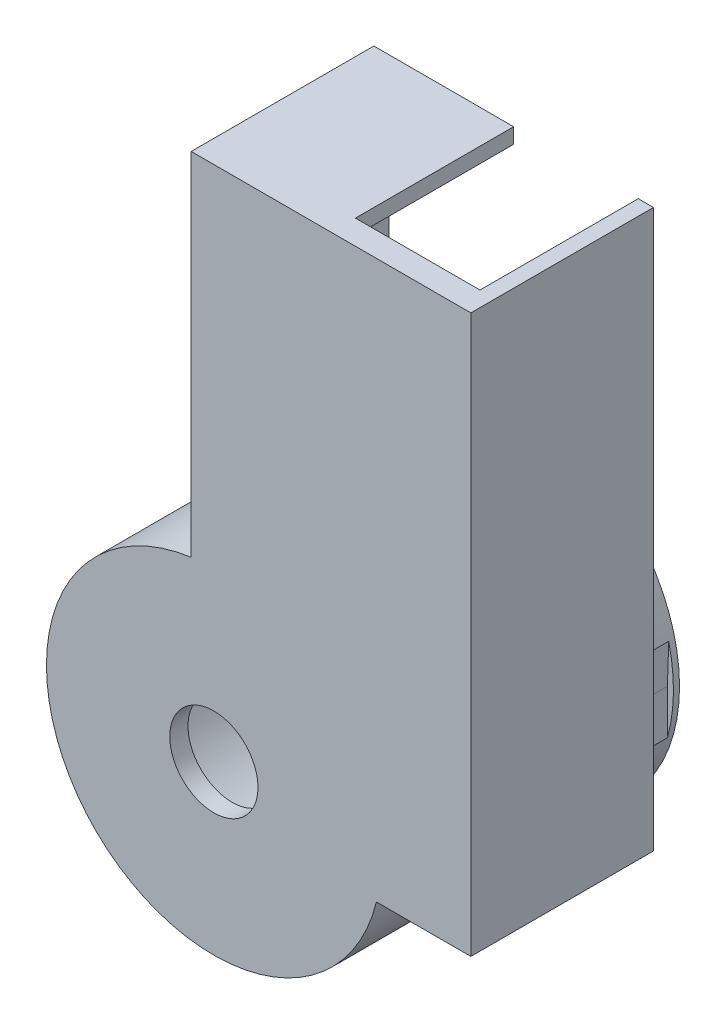
ISO-10303-21;
HEADER;
FILE_DESCRIPTION(('STEP AP214'),'2;1');
FILE_NAME('part.step','',(''),(''),'','','');
FILE_SCHEMA(('AUTOMOTIVE_DESIGN { 1 0 10303 214 1 1 1 1 }'));
ENDSEC;
DATA;
#1=APPLICATION_CONTEXT('core data for automotive mechanical design processes');
#2=APPLICATION_PROTOCOL_DEFINITION('international standard','automotive_design',2000,#1);
#3=PRODUCT_CONTEXT('',#1,'mechanical');
#4=PRODUCT('Part','Part','',(#3));
#5=PRODUCT_RELATED_PRODUCT_CATEGORY('part','',(#4));
#6=PRODUCT_DEFINITION_FORMATION('','',#4);
#7=PRODUCT_DEFINITION_CONTEXT('part definition',#1,'design');
#8=PRODUCT_DEFINITION('design','',#6,#7);
#9=PRODUCT_DEFINITION_SHAPE('','',#8);
#10=(LENGTH_UNIT() NAMED_UNIT(*) SI_UNIT(.MILLI.,.METRE.));
#11=(NAMED_UNIT(*) PLANE_ANGLE_UNIT() SI_UNIT($,.RADIAN.));
#12=(NAMED_UNIT(*) SI_UNIT($,.STERADIAN.) SOLID_ANGLE_UNIT());
#13=UNCERTAINTY_MEASURE_WITH_UNIT(LENGTH_MEASURE(1.E-05),#10,'distance_accuracy_value','');
#14=(GEOMETRIC_REPRESENTATION_CONTEXT(3) GLOBAL_UNCERTAINTY_ASSIGNED_CONTEXT((#13)) GLOBAL_UNIT_ASSIGNED_CONTEXT((#10,
#11,#12)) REPRESENTATION_CONTEXT('',''));
#15=CARTESIAN_POINT('',(0.,0.,0.));
#16=DIRECTION('',(0.,0.,1.));
#17=DIRECTION('',(1.,0.,0.));
#18=AXIS2_PLACEMENT_3D('',#15,#16,#17);
#19=CARTESIAN_POINT('',(0.,-55.,-25.));
#20=DIRECTION('',(0.,0.,1.));
#21=DIRECTION('',(1.,0.,0.));
#22=AXIS2_PLACEMENT_3D('',#19,#20,#21);
#23=CYLINDRICAL_SURFACE('',#22,18.9);
#24=CARTESIAN_POINT('',(0.,-55.,-25.));
#25=DIRECTION('',(0.,0.,-1.));
#26=DIRECTION('',(-1.,0.,0.));
#27=AXIS2_PLACEMENT_3D('',#24,#25,#26);
#28=CIRCLE('',#27,18.9);
#29=CARTESIAN_POINT('',(-18.9,-55.,-25.));
#30=VERTEX_POINT('',#29);
#31=EDGE_CURVE('E253',#30,#30,#28,.T.);
#32=ORIENTED_EDGE('',*,*,#31,.T.);
#33=EDGE_LOOP('',(#32));
#34=FACE_BOUND('',#33,.T.);
#35=CARTESIAN_POINT('',(0.,-55.,21.));
#36=DIRECTION('',(0.,0.,1.));
#37=DIRECTION('',(1.,0.,0.));
#38=AXIS2_PLACEMENT_3D('',#35,#36,#37);
#39=CIRCLE('',#38,18.9);
#40=CARTESIAN_POINT('',(18.9,-55.,21.));
#41=VERTEX_POINT('',#40);
#42=EDGE_CURVE('E506',#41,#41,#39,.T.);
#43=ORIENTED_EDGE('',*,*,#42,.T.);
#44=EDGE_LOOP('',(#43));
#45=FACE_BOUND('',#44,.T.);
#46=ADVANCED_FACE('F76',(#34,#45),#23,.F.);
#47=CARTESIAN_POINT('',(28.235445078776,-0.900390084330371,-24.));
#48=DIRECTION('',(0.999491944603137,-0.0318724437945979,0.));
#49=DIRECTION('',(0.0318724437945979,0.999491944603137,0.));
#50=AXIS2_PLACEMENT_3D('',#47,#48,#49);
#51=PLANE('',#50);
#52=DIRECTION('',(0.,0.,1.));
#53=VECTOR('',#52,1.);
#54=CARTESIAN_POINT('',(26.7179309405717,-48.4883054237133,-24.));
#55=LINE('',#54,#53);
#56=CARTESIAN_POINT('',(26.7179309405717,-48.4883054237133,-1.));
#57=VERTEX_POINT('',#56);
#58=CARTESIAN_POINT('',(26.7179309405717,-48.4883054237133,21.));
#59=VERTEX_POINT('',#58);
#60=EDGE_CURVE('E300',#57,#59,#55,.T.);
#61=ORIENTED_EDGE('',*,*,#60,.T.);
#62=DIRECTION('',(-0.0318724437945979,-0.999491944603137,0.));
#63=VECTOR('',#62,1.);
#64=CARTESIAN_POINT('',(28.235445078776,-0.900390084330371,21.));
#65=LINE('',#64,#63);
#66=CARTESIAN_POINT('',(26.5102818239271,-55.,21.));
#67=VERTEX_POINT('',#66);
#68=EDGE_CURVE('E91',#59,#67,#65,.T.);
#69=ORIENTED_EDGE('',*,*,#68,.T.);
#70=DIRECTION('',(0.,0.,1.));
#71=VECTOR('',#70,1.);
#72=CARTESIAN_POINT('',(26.5102818239271,-55.,-24.));
#73=LINE('',#72,#71);
#74=CARTESIAN_POINT('',(26.5102818239271,-55.,-24.));
#75=VERTEX_POINT('',#74);
#76=EDGE_CURVE('E297',#75,#67,#73,.T.);
#77=ORIENTED_EDGE('',*,*,#76,.F.);
#78=DIRECTION('',(0.0318724437945979,0.999491944603137,0.));
#79=VECTOR('',#78,1.);
#80=CARTESIAN_POINT('',(28.235445078776,-0.900390084330371,-24.));
#81=LINE('',#80,#79);
#82=CARTESIAN_POINT('',(26.7179309405717,-48.4883054237133,-24.));
#83=VERTEX_POINT('',#82);
#84=EDGE_CURVE('E287',#75,#83,#81,.T.);
#85=ORIENTED_EDGE('',*,*,#84,.T.);
#86=EDGE_CURVE('E254',#83,#57,#55,.T.);
#87=ORIENTED_EDGE('',*,*,#86,.T.);
#88=EDGE_LOOP('',(#61,#69,#77,#85,#87));
#89=FACE_BOUND('',#88,.T.);
#90=ADVANCED_FACE('F465',(#89),#51,.T.);
#91=CARTESIAN_POINT('',(26.5102818239271,0.,-24.));
#92=DIRECTION('',(-1.,0.,0.));
#93=DIRECTION('',(0.,0.,1.));
#94=AXIS2_PLACEMENT_3D('',#91,#92,#93);
#95=PLANE('',#94);
#96=DIRECTION('',(0.,1.,0.));
#97=VECTOR('',#96,1.);
#98=CARTESIAN_POINT('',(26.5102818239271,0.,21.));
#99=LINE('',#98,#97);
#100=CARTESIAN_POINT('',(26.5102818239271,-62.3112897368359,21.));
#101=VERTEX_POINT('',#100);
#102=EDGE_CURVE('E98',#101,#67,#99,.T.);
#103=ORIENTED_EDGE('',*,*,#102,.F.);
#104=DIRECTION('',(0.,0.,1.));
#105=VECTOR('',#104,1.);
#106=CARTESIAN_POINT('',(26.5102818239271,-62.3112897368359,-24.));
#107=LINE('',#106,#105);
#108=CARTESIAN_POINT('',(26.5102818239271,-62.3112897368359,-24.));
#109=VERTEX_POINT('',#108);
#110=EDGE_CURVE('E301',#109,#101,#107,.T.);
#111=ORIENTED_EDGE('',*,*,#110,.F.);
#112=DIRECTION('',(0.,-1.,0.));
#113=VECTOR('',#112,1.);
#114=CARTESIAN_POINT('',(26.5102818239271,0.,-24.));
#115=LINE('',#114,#113);
#116=EDGE_CURVE('E291',#75,#109,#115,.T.);
#117=ORIENTED_EDGE('',*,*,#116,.F.);
#118=ORIENTED_EDGE('',*,*,#76,.T.);
#119=EDGE_LOOP('',(#103,#111,#117,#118));
#120=FACE_BOUND('',#119,.T.);
#121=ADVANCED_FACE('F542',(#120),#95,.F.);
#122=CARTESIAN_POINT('',(0.,-81.9229318060306,-24.));
#123=DIRECTION('',(0.,-1.,0.));
#124=DIRECTION('',(0.,0.,-1.));
#125=AXIS2_PLACEMENT_3D('',#122,#123,#124);
#126=PLANE('',#125);
#127=DIRECTION('',(0.,0.,1.));
#128=VECTOR('',#127,1.);
#129=CARTESIAN_POINT('',(5.60408270529834,-81.9229318060306,-24.));
#130=LINE('',#129,#128);
#131=CARTESIAN_POINT('',(5.60408270529834,-81.9229318060306,-24.));
#132=VERTEX_POINT('',#131);
#133=CARTESIAN_POINT('',(5.60408270529834,-81.9229318060306,21.));
#134=VERTEX_POINT('',#133);
#135=EDGE_CURVE('E284',#132,#134,#130,.T.);
#136=ORIENTED_EDGE('',*,*,#135,.T.);
#137=DIRECTION('',(-1.,0.,0.));
#138=VECTOR('',#137,1.);
#139=CARTESIAN_POINT('',(0.,-81.9229318060306,21.));
#140=LINE('',#139,#138);
#141=CARTESIAN_POINT('',(-5.60408270529832,-81.9229318060306,21.));
#142=VERTEX_POINT('',#141);
#143=EDGE_CURVE('E498',#134,#142,#140,.T.);
#144=ORIENTED_EDGE('',*,*,#143,.T.);
#145=DIRECTION('',(0.,0.,1.));
#146=VECTOR('',#145,1.);
#147=CARTESIAN_POINT('',(-5.60408270529832,-81.9229318060306,-24.));
#148=LINE('',#147,#146);
#149=CARTESIAN_POINT('',(-5.60408270529832,-81.9229318060306,-24.));
#150=VERTEX_POINT('',#149);
#151=EDGE_CURVE('E283',#150,#142,#148,.T.);
#152=ORIENTED_EDGE('',*,*,#151,.F.);
#153=DIRECTION('',(1.,0.,0.));
#154=VECTOR('',#153,1.);
#155=CARTESIAN_POINT('',(0.,-81.9229318060306,-24.));
#156=LINE('',#155,#154);
#157=EDGE_CURVE('E277',#150,#132,#156,.T.);
#158=ORIENTED_EDGE('',*,*,#157,.T.);
#159=EDGE_LOOP('',(#136,#144,#152,#158));
#160=FACE_BOUND('',#159,.T.);
#161=ADVANCED_FACE('F567',(#160),#126,.T.);
#162=CARTESIAN_POINT('',(0.,-55.,20.));
#163=DIRECTION('',(0.,0.,1.));
#164=DIRECTION('',(1.,0.,0.));
#165=AXIS2_PLACEMENT_3D('',#162,#163,#164);
#166=CYLINDRICAL_SURFACE('',#165,27.5);
#167=CARTESIAN_POINT('',(0.,-55.,21.));
#168=DIRECTION('',(0.,0.,1.));
#169=DIRECTION('',(1.,0.,0.));
#170=AXIS2_PLACEMENT_3D('',#167,#168,#169);
#171=CIRCLE('',#170,27.5);
#172=CARTESIAN_POINT('',(26.7042036884893,-61.5677625842956,21.));
#173=VERTEX_POINT('',#172);
#174=EDGE_CURVE('E486',#173,#59,#171,.T.);
#175=ORIENTED_EDGE('',*,*,#174,.T.);
#176=ORIENTED_EDGE('',*,*,#60,.F.);
#177=CARTESIAN_POINT('',(1.02890786168874E-13,-55.,-1.));
#178=DIRECTION('',(0.,0.,-1.));
#179=DIRECTION('',(-1.,0.,0.));
#180=AXIS2_PLACEMENT_3D('',#177,#178,#179);
#181=CIRCLE('',#180,27.5);
#182=CARTESIAN_POINT('',(27.19748715521,-50.9322374157041,-1.));
#183=VERTEX_POINT('',#182);
#184=EDGE_CURVE('E340',#57,#183,#181,.T.);
#185=ORIENTED_EDGE('',*,*,#184,.T.);
#186=DIRECTION('',(0.,0.,1.));
#187=VECTOR('',#186,1.);
#188=CARTESIAN_POINT('',(27.19748715521,-50.9322374157041,-1.));
#189=LINE('',#188,#187);
#190=CARTESIAN_POINT('',(27.19748715521,-50.9322374157041,15.));
#191=VERTEX_POINT('',#190);
#192=EDGE_CURVE('E329',#183,#191,#189,.T.);
#193=ORIENTED_EDGE('',*,*,#192,.T.);
#194=CARTESIAN_POINT('',(0.,-55.,15.));
#195=DIRECTION('',(0.,0.,1.));
#196=DIRECTION('',(1.,0.,0.));
#197=AXIS2_PLACEMENT_3D('',#194,#195,#196);
#198=CIRCLE('',#197,27.5000000000001);
#199=CARTESIAN_POINT('',(27.19748715521,-59.0677625842956,15.));
#200=VERTEX_POINT('',#199);
#201=EDGE_CURVE('E338',#200,#191,#198,.T.);
#202=ORIENTED_EDGE('',*,*,#201,.F.);
#203=DIRECTION('',(0.,0.,-1.));
#204=VECTOR('',#203,1.);
#205=CARTESIAN_POINT('',(27.19748715521,-59.0677625842956,15.));
#206=LINE('',#205,#204);
#207=CARTESIAN_POINT('',(27.19748715521,-59.0677625842956,-6.));
#208=VERTEX_POINT('',#207);
#209=EDGE_CURVE('E366',#200,#208,#206,.T.);
#210=ORIENTED_EDGE('',*,*,#209,.T.);
#211=CARTESIAN_POINT('',(9.26342336171615E-13,-54.9999999999992,-6.));
#212=DIRECTION('',(0.,0.,1.));
#213=DIRECTION('',(-1.,0.,0.));
#214=AXIS2_PLACEMENT_3D('',#211,#212,#213);
#215=CIRCLE('',#214,27.4999999999993);
#216=CARTESIAN_POINT('',(26.7042036884893,-61.5677625842956,-6.));
#217=VERTEX_POINT('',#216);
#218=EDGE_CURVE('E393',#217,#208,#215,.T.);
#219=ORIENTED_EDGE('',*,*,#218,.F.);
#220=DIRECTION('',(0.,0.,1.));
#221=VECTOR('',#220,1.);
#222=CARTESIAN_POINT('',(26.7042036884893,-61.5677625842956,20.));
#223=LINE('',#222,#221);
#224=EDGE_CURVE('E270',#217,#173,#223,.T.);
#225=ORIENTED_EDGE('',*,*,#224,.T.);
#226=EDGE_LOOP('',(#175,#176,#185,#193,#202,#210,#219,#225));
#227=FACE_BOUND('',#226,.T.);
#228=ADVANCED_FACE('F336',(#227),#166,.F.);
#229=CARTESIAN_POINT('',(9.26342336171615E-13,-54.9999999999992,-6.));
#230=DIRECTION('',(0.,0.,1.));
#231=DIRECTION('',(1.,0.,0.));
#232=AXIS2_PLACEMENT_3D('',#229,#230,#231);
#233=PLANE('',#232);
#234=DIRECTION('',(0.,-1.,0.));
#235=VECTOR('',#234,1.);
#236=CARTESIAN_POINT('',(39.7172468413498,29.9886968621763,-6.));
#237=LINE('',#236,#235);
#238=CARTESIAN_POINT('',(39.7172468413498,29.9886968621763,-6.));
#239=VERTEX_POINT('',#238);
#240=CARTESIAN_POINT('',(39.7172468413498,-59.0677625842956,-6.));
#241=VERTEX_POINT('',#240);
#242=EDGE_CURVE('E376',#239,#241,#237,.T.);
#243=ORIENTED_EDGE('',*,*,#242,.F.);
#244=DIRECTION('',(1.,0.,0.));
#245=VECTOR('',#244,1.);
#246=CARTESIAN_POINT('',(42.2172468413498,29.9886968621763,-6.));
#247=LINE('',#246,#245);
#248=CARTESIAN_POINT('',(42.2172468413498,29.9886968621763,-6.));
#249=VERTEX_POINT('',#248);
#250=EDGE_CURVE('E399',#239,#249,#247,.T.);
#251=ORIENTED_EDGE('',*,*,#250,.T.);
#252=DIRECTION('',(0.,-1.,0.));
#253=VECTOR('',#252,1.);
#254=CARTESIAN_POINT('',(42.2172468413498,29.9886968621763,-6.));
#255=LINE('',#254,#253);
#256=CARTESIAN_POINT('',(42.2172468413498,-61.5677625842956,-6.));
#257=VERTEX_POINT('',#256);
#258=EDGE_CURVE('E403',#249,#257,#255,.T.);
#259=ORIENTED_EDGE('',*,*,#258,.T.);
#260=DIRECTION('',(-1.,0.,0.));
#261=VECTOR('',#260,1.);
#262=CARTESIAN_POINT('',(26.7042036884893,-61.5677625842956,-6.));
#263=LINE('',#262,#261);
#264=EDGE_CURVE('E264',#257,#217,#263,.T.);
#265=ORIENTED_EDGE('',*,*,#264,.T.);
#266=ORIENTED_EDGE('',*,*,#218,.T.);
#267=DIRECTION('',(-1.,0.,0.));
#268=VECTOR('',#267,1.);
#269=CARTESIAN_POINT('',(26.7042036884893,-59.0677625842956,-6.));
#270=LINE('',#269,#268);
#271=EDGE_CURVE('E379',#241,#208,#270,.T.);
#272=ORIENTED_EDGE('',*,*,#271,.F.);
#273=EDGE_LOOP('',(#243,#251,#259,#265,#266,#272));
#274=FACE_BOUND('',#273,.T.);
#275=ADVANCED_FACE('F484',(#274),#233,.F.);
#276=CARTESIAN_POINT('',(0.,-55.,15.));
#277=DIRECTION('',(0.,0.,-1.));
#278=DIRECTION('',(-1.,0.,0.));
#279=AXIS2_PLACEMENT_3D('',#276,#277,#278);
#280=PLANE('',#279);
#281=CARTESIAN_POINT('',(0.,-55.,15.));
#282=DIRECTION('',(0.,0.,-1.));
#283=DIRECTION('',(-1.,0.,0.));
#284=AXIS2_PLACEMENT_3D('',#281,#282,#283);
#285=CIRCLE('',#284,30.0000000000001);
#286=CARTESIAN_POINT('',(-1.21934232207703,-25.0247901708496,15.));
#287=VERTEX_POINT('',#286);
#288=CARTESIAN_POINT('',(11.9895788082825,-27.5000000000002,15.));
#289=VERTEX_POINT('',#288);
#290=EDGE_CURVE('E355',#287,#289,#285,.T.);
#291=ORIENTED_EDGE('',*,*,#290,.T.);
#292=DIRECTION('',(-1.,0.,0.));
#293=VECTOR('',#292,1.);
#294=CARTESIAN_POINT('',(0.,-27.4999999999999,15.));
#295=LINE('',#294,#293);
#296=CARTESIAN_POINT('',(0.,-27.4999999999999,15.));
#297=VERTEX_POINT('',#296);
#298=EDGE_CURVE('E12',#289,#297,#295,.T.);
#299=ORIENTED_EDGE('',*,*,#298,.T.);
#300=CARTESIAN_POINT('',(-1.348702704197,-27.5330926201056,15.));
#301=VERTEX_POINT('',#300);
#302=EDGE_CURVE('E361',#297,#301,#198,.T.);
#303=ORIENTED_EDGE('',*,*,#302,.T.);
#304=DIRECTION('',(0.0515044310795822,0.998672766014558,0.));
#305=VECTOR('',#304,1.);
#306=CARTESIAN_POINT('',(-1.348702704197,-27.5330926201056,15.));
#307=LINE('',#306,#305);
#308=EDGE_CURVE('E363',#301,#287,#307,.T.);
#309=ORIENTED_EDGE('',*,*,#308,.T.);
#310=EDGE_LOOP('',(#291,#299,#303,#309));
#311=FACE_BOUND('',#310,.T.);
#312=ADVANCED_FACE('F453',(#311),#280,.T.);
#313=CARTESIAN_POINT('',(9.26342336171615E-13,-54.9999999999992,-6.));
#314=DIRECTION('',(0.,0.,1.));
#315=DIRECTION('',(1.,0.,0.));
#316=AXIS2_PLACEMENT_3D('',#313,#314,#315);
#317=CYLINDRICAL_SURFACE('',#316,29.9999999999993);
#318=CARTESIAN_POINT('',(27.19748715521,-42.3391669925634,15.));
#319=VERTEX_POINT('',#318);
#320=CARTESIAN_POINT('',(29.722942444479,-59.0677625842956,15.));
#321=VERTEX_POINT('',#320);
#322=EDGE_CURVE('E358',#319,#321,#285,.T.);
#323=ORIENTED_EDGE('',*,*,#322,.F.);
#324=DIRECTION('',(0.,0.,1.));
#325=VECTOR('',#324,1.);
#326=CARTESIAN_POINT('',(27.19748715521,-42.3391669925625,-1.));
#327=LINE('',#326,#325);
#328=CARTESIAN_POINT('',(27.19748715521,-42.3391669925625,-1.));
#329=VERTEX_POINT('',#328);
#330=EDGE_CURVE('E331',#329,#319,#327,.T.);
#331=ORIENTED_EDGE('',*,*,#330,.F.);
#332=CARTESIAN_POINT('',(9.26342336171615E-13,-54.9999999999992,-1.));
#333=DIRECTION('',(0.,0.,-1.));
#334=DIRECTION('',(-1.,0.,0.));
#335=AXIS2_PLACEMENT_3D('',#332,#333,#334);
#336=CIRCLE('',#335,29.9999999999993);
#337=CARTESIAN_POINT('',(11.9895788082827,-27.4999999999999,-1.));
#338=VERTEX_POINT('',#337);
#339=EDGE_CURVE('E345',#329,#338,#336,.F.);
#340=ORIENTED_EDGE('',*,*,#339,.T.);
#341=DIRECTION('',(0.,0.,1.));
#342=VECTOR('',#341,1.);
#343=CARTESIAN_POINT('',(11.9895788082827,-27.4999999999999,-1.));
#344=LINE('',#343,#342);
#345=EDGE_CURVE('E343',#338,#289,#344,.T.);
#346=ORIENTED_EDGE('',*,*,#345,.T.);
#347=ORIENTED_EDGE('',*,*,#290,.F.);
#348=DIRECTION('',(0.,0.,1.));
#349=VECTOR('',#348,1.);
#350=CARTESIAN_POINT('',(-1.21934232207703,-25.0247901708496,-6.));
#351=LINE('',#350,#349);
#352=CARTESIAN_POINT('',(-1.21934232207703,-25.0247901708496,20.));
#353=VERTEX_POINT('',#352);
#354=EDGE_CURVE('E389',#287,#353,#351,.T.);
#355=ORIENTED_EDGE('',*,*,#354,.T.);
#356=CARTESIAN_POINT('',(9.26342336171615E-13,-54.9999999999992,20.));
#357=DIRECTION('',(0.,0.,1.));
#358=DIRECTION('',(1.,0.,0.));
#359=AXIS2_PLACEMENT_3D('',#356,#357,#358);
#360=CIRCLE('',#359,29.9999999999993);
#361=CARTESIAN_POINT('',(29.722942444479,-59.0677625842956,20.));
#362=VERTEX_POINT('',#361);
#363=EDGE_CURVE('E321',#362,#353,#360,.T.);
#364=ORIENTED_EDGE('',*,*,#363,.F.);
#365=DIRECTION('',(0.,0.,1.));
#366=VECTOR('',#365,1.);
#367=CARTESIAN_POINT('',(29.722942444479,-59.0677625842956,-6.));
#368=LINE('',#367,#366);
#369=EDGE_CURVE('E381',#321,#362,#368,.T.);
#370=ORIENTED_EDGE('',*,*,#369,.F.);
#371=EDGE_LOOP('',(#323,#331,#340,#346,#347,#355,#364,#370));
#372=FACE_BOUND('',#371,.T.);
#373=ADVANCED_FACE('F447',(#372),#317,.T.);
#374=CARTESIAN_POINT('',(0.,-55.,24.));
#375=DIRECTION('',(0.,0.,-1.));
#376=DIRECTION('',(-1.,0.,0.));
#377=AXIS2_PLACEMENT_3D('',#374,#375,#376);
#378=CYLINDRICAL_SURFACE('',#377,27.5);
#379=ORIENTED_EDGE('',*,*,#151,.T.);
#380=EDGE_CURVE('E491',#142,#134,#171,.T.);
#381=ORIENTED_EDGE('',*,*,#380,.T.);
#382=ORIENTED_EDGE('',*,*,#135,.F.);
#383=CARTESIAN_POINT('',(0.,-55.,-24.));
#384=DIRECTION('',(0.,0.,1.));
#385=DIRECTION('',(1.,0.,0.));
#386=AXIS2_PLACEMENT_3D('',#383,#384,#385);
#387=CIRCLE('',#386,27.5);
#388=EDGE_CURVE('E279',#150,#132,#387,.T.);
#389=ORIENTED_EDGE('',*,*,#388,.F.);
#390=EDGE_LOOP('',(#379,#381,#382,#389));
#391=FACE_BOUND('',#390,.T.);
#392=CARTESIAN_POINT('',(0.,-55.,24.));
#393=DIRECTION('',(0.,0.,1.));
#394=DIRECTION('',(1.,0.,0.));
#395=AXIS2_PLACEMENT_3D('',#392,#393,#394);
#396=CIRCLE('',#395,27.5);
#397=CARTESIAN_POINT('',(-3.71934232207703,-27.7526791648939,24.));
#398=VERTEX_POINT('',#397);
#399=CARTESIAN_POINT('',(26.7042036884893,-61.5677625842956,24.));
#400=VERTEX_POINT('',#399);
#401=EDGE_CURVE('E240',#398,#400,#396,.T.);
#402=ORIENTED_EDGE('',*,*,#401,.F.);
#403=DIRECTION('',(0.,0.,1.));
#404=VECTOR('',#403,1.);
#405=CARTESIAN_POINT('',(-3.71934232207703,-27.7526791648939,20.));
#406=LINE('',#405,#404);
#407=CARTESIAN_POINT('',(-3.71934232207703,-27.7526791648939,-6.));
#408=VERTEX_POINT('',#407);
#409=EDGE_CURVE('E280',#408,#398,#406,.T.);
#410=ORIENTED_EDGE('',*,*,#409,.F.);
#411=CARTESIAN_POINT('',(-1.348702704197,-27.5330926201056,-6.));
#412=VERTEX_POINT('',#411);
#413=EDGE_CURVE('E392',#412,#408,#215,.T.);
#414=ORIENTED_EDGE('',*,*,#413,.F.);
#415=DIRECTION('',(0.,0.,-1.));
#416=VECTOR('',#415,1.);
#417=CARTESIAN_POINT('',(-1.348702704197,-27.5330926201056,15.));
#418=LINE('',#417,#416);
#419=EDGE_CURVE('E368',#301,#412,#418,.T.);
#420=ORIENTED_EDGE('',*,*,#419,.F.);
#421=ORIENTED_EDGE('',*,*,#302,.F.);
#422=DIRECTION('',(0.,0.,1.));
#423=VECTOR('',#422,1.);
#424=CARTESIAN_POINT('',(1.02751297047818E-13,-27.4999999999999,-1.));
#425=LINE('',#424,#423);
#426=CARTESIAN_POINT('',(1.02751297047818E-13,-27.5,-1.));
#427=VERTEX_POINT('',#426);
#428=EDGE_CURVE('E351',#427,#297,#425,.T.);
#429=ORIENTED_EDGE('',*,*,#428,.F.);
#430=EDGE_CURVE('E461',#427,#57,#181,.T.);
#431=ORIENTED_EDGE('',*,*,#430,.T.);
#432=ORIENTED_EDGE('',*,*,#86,.F.);
#433=CARTESIAN_POINT('',(0.,-55.,-24.));
#434=DIRECTION('',(0.,0.,1.));
#435=DIRECTION('',(1.,0.,0.));
#436=AXIS2_PLACEMENT_3D('',#433,#434,#435);
#437=CIRCLE('',#436,27.5);
#438=EDGE_CURVE('E294',#109,#83,#437,.T.);
#439=ORIENTED_EDGE('',*,*,#438,.F.);
#440=ORIENTED_EDGE('',*,*,#110,.T.);
#441=EDGE_CURVE('E269',#101,#173,#171,.T.);
#442=ORIENTED_EDGE('',*,*,#441,.T.);
#443=EDGE_CURVE('E258',#173,#400,#223,.T.);
#444=ORIENTED_EDGE('',*,*,#443,.T.);
#445=EDGE_LOOP('',(#402,#410,#414,#420,#421,#429,#431,#432,#439,#440,#442,#444));
#446=FACE_BOUND('',#445,.T.);
#447=CARTESIAN_POINT('',(0.,-55.,-25.));
#448=DIRECTION('',(0.,0.,-1.));
#449=DIRECTION('',(-1.,0.,0.));
#450=AXIS2_PLACEMENT_3D('',#447,#448,#449);
#451=CIRCLE('',#450,27.5);
#452=CARTESIAN_POINT('',(-27.5,-55.,-25.));
#453=VERTEX_POINT('',#452);
#454=EDGE_CURVE('E306',#453,#453,#451,.T.);
#455=ORIENTED_EDGE('',*,*,#454,.F.);
#456=EDGE_LOOP('',(#455));
#457=FACE_BOUND('',#456,.T.);
#458=ADVANCED_FACE('F78',(#391,#446,#457),#378,.T.);
#459=CARTESIAN_POINT('',(0.,-55.,24.));
#460=DIRECTION('',(0.,0.,1.));
#461=DIRECTION('',(1.,0.,0.));
#462=AXIS2_PLACEMENT_3D('',#459,#460,#461);
#463=PLANE('',#462);
#464=DIRECTION('',(0.,-1.,0.));
#465=VECTOR('',#464,1.);
#466=CARTESIAN_POINT('',(-3.71934232207703,0.,24.));
#467=LINE('',#466,#465);
#468=CARTESIAN_POINT('',(-3.71934232207703,29.9886968621763,24.));
#469=VERTEX_POINT('',#468);
#470=EDGE_CURVE('E248',#469,#398,#467,.T.);
#471=ORIENTED_EDGE('',*,*,#470,.T.);
#472=ORIENTED_EDGE('',*,*,#401,.T.);
#473=DIRECTION('',(1.,0.,0.));
#474=VECTOR('',#473,1.);
#475=CARTESIAN_POINT('',(0.,-61.5677625842956,24.));
#476=LINE('',#475,#474);
#477=CARTESIAN_POINT('',(42.2172468413498,-61.5677625842956,24.));
#478=VERTEX_POINT('',#477);
#479=EDGE_CURVE('E245',#400,#478,#476,.T.);
#480=ORIENTED_EDGE('',*,*,#479,.T.);
#481=DIRECTION('',(0.,1.,0.));
#482=VECTOR('',#481,1.);
#483=CARTESIAN_POINT('',(42.2172468413498,0.,24.));
#484=LINE('',#483,#482);
#485=CARTESIAN_POINT('',(42.2172468413498,29.9886968621763,24.));
#486=VERTEX_POINT('',#485);
#487=EDGE_CURVE('E263',#478,#486,#484,.T.);
#488=ORIENTED_EDGE('',*,*,#487,.T.);
#489=DIRECTION('',(-1.,0.,0.));
#490=VECTOR('',#489,1.);
#491=CARTESIAN_POINT('',(0.,29.9886968621763,24.));
#492=LINE('',#491,#490);
#493=EDGE_CURVE('E272',#486,#469,#492,.T.);
#494=ORIENTED_EDGE('',*,*,#493,.T.);
#495=EDGE_LOOP('',(#471,#472,#480,#488,#494));
#496=FACE_BOUND('',#495,.T.);
#497=CARTESIAN_POINT('',(0.,-55.,24.));
#498=DIRECTION('',(0.,0.,1.));
#499=DIRECTION('',(1.,0.,0.));
#500=AXIS2_PLACEMENT_3D('',#497,#498,#499);
#501=CIRCLE('',#500,7.25);
#502=CARTESIAN_POINT('',(7.25000000000001,-55.,24.));
#503=VERTEX_POINT('',#502);
#504=EDGE_CURVE('E493',#503,#503,#501,.T.);
#505=ORIENTED_EDGE('',*,*,#504,.F.);
#506=EDGE_LOOP('',(#505));
#507=FACE_BOUND('',#506,.T.);
#508=ADVANCED_FACE('F242',(#496,#507),#463,.T.);
#509=CARTESIAN_POINT('',(0.,-55.,-25.));
#510=DIRECTION('',(0.,0.,-1.));
#511=DIRECTION('',(-1.,0.,0.));
#512=AXIS2_PLACEMENT_3D('',#509,#510,#511);
#513=PLANE('',#512);
#514=ORIENTED_EDGE('',*,*,#454,.T.);
#515=EDGE_LOOP('',(#514));
#516=FACE_BOUND('',#515,.T.);
#517=ORIENTED_EDGE('',*,*,#31,.F.);
#518=EDGE_LOOP('',(#517));
#519=FACE_BOUND('',#518,.T.);
#520=ADVANCED_FACE('F546',(#516,#519),#513,.T.);
#521=CARTESIAN_POINT('',(0.,0.,-24.));
#522=DIRECTION('',(0.,0.,1.));
#523=DIRECTION('',(1.,0.,0.));
#524=AXIS2_PLACEMENT_3D('',#521,#522,#523);
#525=PLANE('',#524);
#526=ORIENTED_EDGE('',*,*,#84,.F.);
#527=ORIENTED_EDGE('',*,*,#116,.T.);
#528=ORIENTED_EDGE('',*,*,#438,.T.);
#529=EDGE_LOOP('',(#526,#527,#528));
#530=FACE_BOUND('',#529,.T.);
#531=ADVANCED_FACE('F548',(#530),#525,.T.);
#532=CARTESIAN_POINT('',(0.,0.,-24.));
#533=DIRECTION('',(0.,0.,1.));
#534=DIRECTION('',(1.,0.,0.));
#535=AXIS2_PLACEMENT_3D('',#532,#533,#534);
#536=PLANE('',#535);
#537=ORIENTED_EDGE('',*,*,#157,.F.);
#538=ORIENTED_EDGE('',*,*,#388,.T.);
#539=EDGE_LOOP('',(#537,#538));
#540=FACE_BOUND('',#539,.T.);
#541=ADVANCED_FACE('F554',(#540),#536,.T.);
#542=CARTESIAN_POINT('',(-3.71934232207703,0.,20.));
#543=DIRECTION('',(-1.,0.,0.));
#544=DIRECTION('',(0.,0.,1.));
#545=AXIS2_PLACEMENT_3D('',#542,#543,#544);
#546=PLANE('',#545);
#547=ORIENTED_EDGE('',*,*,#470,.F.);
#548=DIRECTION('',(0.,0.,1.));
#549=VECTOR('',#548,1.);
#550=CARTESIAN_POINT('',(-3.71934232207703,29.9886968621763,20.));
#551=LINE('',#550,#549);
#552=CARTESIAN_POINT('',(-3.71934232207703,29.9886968621763,-6.));
#553=VERTEX_POINT('',#552);
#554=EDGE_CURVE('E411',#553,#469,#551,.T.);
#555=ORIENTED_EDGE('',*,*,#554,.F.);
#556=DIRECTION('',(0.,1.,0.));
#557=VECTOR('',#556,1.);
#558=CARTESIAN_POINT('',(-3.71934232207703,29.9886968621763,-6.));
#559=LINE('',#558,#557);
#560=EDGE_CURVE('E396',#408,#553,#559,.T.);
#561=ORIENTED_EDGE('',*,*,#560,.F.);
#562=ORIENTED_EDGE('',*,*,#409,.T.);
#563=EDGE_LOOP('',(#547,#555,#561,#562));
#564=FACE_BOUND('',#563,.T.);
#565=ADVANCED_FACE('F424',(#564),#546,.T.);
#566=CARTESIAN_POINT('',(0.,29.9886968621763,20.));
#567=DIRECTION('',(0.,1.,0.));
#568=DIRECTION('',(0.,0.,1.));
#569=AXIS2_PLACEMENT_3D('',#566,#567,#568);
#570=PLANE('',#569);
#571=DIRECTION('',(1.,0.,0.));
#572=VECTOR('',#571,1.);
#573=CARTESIAN_POINT('',(19.2489522596364,29.9886968621763,20.));
#574=LINE('',#573,#572);
#575=CARTESIAN_POINT('',(19.2489522596364,29.9886968621763,20.));
#576=VERTEX_POINT('',#575);
#577=CARTESIAN_POINT('',(39.7172468413498,29.9886968621763,20.));
#578=VERTEX_POINT('',#577);
#579=EDGE_CURVE('E512',#576,#578,#574,.T.);
#580=ORIENTED_EDGE('',*,*,#579,.F.);
#581=DIRECTION('',(0.,0.,-1.));
#582=VECTOR('',#581,1.);
#583=CARTESIAN_POINT('',(19.2489522596364,29.9886968621763,15.));
#584=LINE('',#583,#582);
#585=CARTESIAN_POINT('',(19.2489522596364,29.9886968621763,-6.));
#586=VERTEX_POINT('',#585);
#587=EDGE_CURVE('E471',#576,#586,#584,.T.);
#588=ORIENTED_EDGE('',*,*,#587,.T.);
#589=EDGE_CURVE('E400',#553,#586,#247,.T.);
#590=ORIENTED_EDGE('',*,*,#589,.F.);
#591=ORIENTED_EDGE('',*,*,#554,.T.);
#592=ORIENTED_EDGE('',*,*,#493,.F.);
#593=DIRECTION('',(0.,0.,1.));
#594=VECTOR('',#593,1.);
#595=CARTESIAN_POINT('',(42.2172468413498,29.9886968621763,20.));
#596=LINE('',#595,#594);
#597=EDGE_CURVE('E412',#249,#486,#596,.T.);
#598=ORIENTED_EDGE('',*,*,#597,.F.);
#599=ORIENTED_EDGE('',*,*,#250,.F.);
#600=DIRECTION('',(0.,0.,-1.));
#601=VECTOR('',#600,1.);
#602=CARTESIAN_POINT('',(39.7172468413498,29.9886968621763,15.));
#603=LINE('',#602,#601);
#604=EDGE_CURVE('E469',#578,#239,#603,.T.);
#605=ORIENTED_EDGE('',*,*,#604,.F.);
#606=EDGE_LOOP('',(#580,#588,#590,#591,#592,#598,#599,#605));
#607=FACE_BOUND('',#606,.T.);
#608=ADVANCED_FACE('F421',(#607),#570,.T.);
#609=CARTESIAN_POINT('',(42.2172468413498,0.,20.));
#610=DIRECTION('',(1.,0.,0.));
#611=DIRECTION('',(0.,0.,-1.));
#612=AXIS2_PLACEMENT_3D('',#609,#610,#611);
#613=PLANE('',#612);
#614=ORIENTED_EDGE('',*,*,#487,.F.);
#615=DIRECTION('',(0.,0.,1.));
#616=VECTOR('',#615,1.);
#617=CARTESIAN_POINT('',(42.2172468413498,-61.5677625842956,20.));
#618=LINE('',#617,#616);
#619=EDGE_CURVE('E261',#257,#478,#618,.T.);
#620=ORIENTED_EDGE('',*,*,#619,.F.);
#621=ORIENTED_EDGE('',*,*,#258,.F.);
#622=ORIENTED_EDGE('',*,*,#597,.T.);
#623=EDGE_LOOP('',(#614,#620,#621,#622));
#624=FACE_BOUND('',#623,.T.);
#625=ADVANCED_FACE('F417',(#624),#613,.T.);
#626=CARTESIAN_POINT('',(0.,-61.5677625842956,20.));
#627=DIRECTION('',(0.,-1.,0.));
#628=DIRECTION('',(0.,0.,-1.));
#629=AXIS2_PLACEMENT_3D('',#626,#627,#628);
#630=PLANE('',#629);
#631=ORIENTED_EDGE('',*,*,#479,.F.);
#632=ORIENTED_EDGE('',*,*,#443,.F.);
#633=ORIENTED_EDGE('',*,*,#224,.F.);
#634=ORIENTED_EDGE('',*,*,#264,.F.);
#635=ORIENTED_EDGE('',*,*,#619,.T.);
#636=EDGE_LOOP('',(#631,#632,#633,#634,#635));
#637=FACE_BOUND('',#636,.T.);
#638=ADVANCED_FACE('F257',(#637),#630,.T.);
#639=CARTESIAN_POINT('',(-1.21934232207703,29.9886968621763,-6.));
#640=DIRECTION('',(1.,0.,0.));
#641=DIRECTION('',(0.,0.,-1.));
#642=AXIS2_PLACEMENT_3D('',#639,#640,#641);
#643=PLANE('',#642);
#644=DIRECTION('',(0.,1.,0.));
#645=VECTOR('',#644,1.);
#646=CARTESIAN_POINT('',(-1.21934232207703,0.,20.));
#647=LINE('',#646,#645);
#648=CARTESIAN_POINT('',(-1.21934232207703,27.4886968621763,20.));
#649=VERTEX_POINT('',#648);
#650=EDGE_CURVE('E318',#353,#649,#647,.T.);
#651=ORIENTED_EDGE('',*,*,#650,.F.);
#652=ORIENTED_EDGE('',*,*,#354,.F.);
#653=CARTESIAN_POINT('',(-1.21934232207703,-25.0247901708496,-6.));
#654=VERTEX_POINT('',#653);
#655=EDGE_CURVE('E390',#654,#287,#351,.T.);
#656=ORIENTED_EDGE('',*,*,#655,.F.);
#657=DIRECTION('',(0.,1.,0.));
#658=VECTOR('',#657,1.);
#659=CARTESIAN_POINT('',(-1.21934232207703,29.9886968621763,-6.));
#660=LINE('',#659,#658);
#661=CARTESIAN_POINT('',(-1.21934232207703,27.4886968621763,-6.));
#662=VERTEX_POINT('',#661);
#663=EDGE_CURVE('E370',#654,#662,#660,.T.);
#664=ORIENTED_EDGE('',*,*,#663,.T.);
#665=DIRECTION('',(0.,0.,1.));
#666=VECTOR('',#665,1.);
#667=CARTESIAN_POINT('',(-1.21934232207703,27.4886968621763,-6.));
#668=LINE('',#667,#666);
#669=EDGE_CURVE('E386',#662,#649,#668,.T.);
#670=ORIENTED_EDGE('',*,*,#669,.T.);
#671=EDGE_LOOP('',(#651,#652,#656,#664,#670));
#672=FACE_BOUND('',#671,.T.);
#673=ADVANCED_FACE('F441',(#672),#643,.T.);
#674=CARTESIAN_POINT('',(42.2172468413498,27.4886968621763,-6.));
#675=DIRECTION('',(0.,-1.,0.));
#676=DIRECTION('',(0.,0.,-1.));
#677=AXIS2_PLACEMENT_3D('',#674,#675,#676);
#678=PLANE('',#677);
#679=DIRECTION('',(0.,0.,-1.));
#680=VECTOR('',#679,1.);
#681=CARTESIAN_POINT('',(19.2489522596364,27.4886968621763,15.));
#682=LINE('',#681,#680);
#683=CARTESIAN_POINT('',(19.2489522596364,27.4886968621763,20.));
#684=VERTEX_POINT('',#683);
#685=CARTESIAN_POINT('',(19.2489522596364,27.4886968621763,-6.));
#686=VERTEX_POINT('',#685);
#687=EDGE_CURVE('E475',#684,#686,#682,.T.);
#688=ORIENTED_EDGE('',*,*,#687,.F.);
#689=DIRECTION('',(1.,0.,0.));
#690=VECTOR('',#689,1.);
#691=CARTESIAN_POINT('',(0.,27.4886968621763,20.));
#692=LINE('',#691,#690);
#693=EDGE_CURVE('E315',#649,#684,#692,.T.);
#694=ORIENTED_EDGE('',*,*,#693,.F.);
#695=ORIENTED_EDGE('',*,*,#669,.F.);
#696=DIRECTION('',(1.,0.,0.));
#697=VECTOR('',#696,1.);
#698=CARTESIAN_POINT('',(42.2172468413498,27.4886968621763,-6.));
#699=LINE('',#698,#697);
#700=EDGE_CURVE('E373',#662,#686,#699,.T.);
#701=ORIENTED_EDGE('',*,*,#700,.T.);
#702=EDGE_LOOP('',(#688,#694,#695,#701));
#703=FACE_BOUND('',#702,.T.);
#704=ADVANCED_FACE('F522',(#703),#678,.T.);
#705=CARTESIAN_POINT('',(39.7172468413498,29.9886968621763,-6.));
#706=DIRECTION('',(-1.,0.,0.));
#707=DIRECTION('',(0.,0.,1.));
#708=AXIS2_PLACEMENT_3D('',#705,#706,#707);
#709=PLANE('',#708);
#710=DIRECTION('',(0.,-1.,0.));
#711=VECTOR('',#710,1.);
#712=CARTESIAN_POINT('',(39.7172468413498,0.,20.));
#713=LINE('',#712,#711);
#714=CARTESIAN_POINT('',(39.7172468413498,-59.0677625842956,20.));
#715=VERTEX_POINT('',#714);
#716=EDGE_CURVE('E312',#578,#715,#713,.T.);
#717=ORIENTED_EDGE('',*,*,#716,.F.);
#718=ORIENTED_EDGE('',*,*,#604,.T.);
#719=ORIENTED_EDGE('',*,*,#242,.T.);
#720=DIRECTION('',(0.,0.,1.));
#721=VECTOR('',#720,1.);
#722=CARTESIAN_POINT('',(39.7172468413498,-59.0677625842956,-6.));
#723=LINE('',#722,#721);
#724=EDGE_CURVE('E383',#241,#715,#723,.T.);
#725=ORIENTED_EDGE('',*,*,#724,.T.);
#726=EDGE_LOOP('',(#717,#718,#719,#725));
#727=FACE_BOUND('',#726,.T.);
#728=ADVANCED_FACE('F526',(#727),#709,.T.);
#729=CARTESIAN_POINT('',(26.7042036884893,-59.0677625842956,-6.));
#730=DIRECTION('',(0.,1.,0.));
#731=DIRECTION('',(0.,0.,1.));
#732=AXIS2_PLACEMENT_3D('',#729,#730,#731);
#733=PLANE('',#732);
#734=DIRECTION('',(-1.,0.,0.));
#735=VECTOR('',#734,1.);
#736=CARTESIAN_POINT('',(0.,-59.0677625842956,20.));
#737=LINE('',#736,#735);
#738=EDGE_CURVE('E309',#715,#362,#737,.T.);
#739=ORIENTED_EDGE('',*,*,#738,.F.);
#740=ORIENTED_EDGE('',*,*,#724,.F.);
#741=ORIENTED_EDGE('',*,*,#271,.T.);
#742=ORIENTED_EDGE('',*,*,#209,.F.);
#743=DIRECTION('',(-1.,0.,0.));
#744=VECTOR('',#743,1.);
#745=CARTESIAN_POINT('',(29.722942444479,-59.0677625842956,15.));
#746=LINE('',#745,#744);
#747=EDGE_CURVE('E357',#321,#200,#746,.T.);
#748=ORIENTED_EDGE('',*,*,#747,.F.);
#749=ORIENTED_EDGE('',*,*,#369,.T.);
#750=EDGE_LOOP('',(#739,#740,#741,#742,#748,#749));
#751=FACE_BOUND('',#750,.T.);
#752=ADVANCED_FACE('F480',(#751),#733,.T.);
#753=ORIENTED_EDGE('',*,*,#589,.T.);
#754=DIRECTION('',(0.,1.,0.));
#755=VECTOR('',#754,1.);
#756=CARTESIAN_POINT('',(19.2489522596364,29.9886968621763,-6.));
#757=LINE('',#756,#755);
#758=EDGE_CURVE('E515',#686,#586,#757,.T.);
#759=ORIENTED_EDGE('',*,*,#758,.F.);
#760=ORIENTED_EDGE('',*,*,#700,.F.);
#761=ORIENTED_EDGE('',*,*,#663,.F.);
#762=DIRECTION('',(0.0515044310795822,0.998672766014558,0.));
#763=VECTOR('',#762,1.);
#764=CARTESIAN_POINT('',(-1.348702704197,-27.5330926201056,-6.));
#765=LINE('',#764,#763);
#766=EDGE_CURVE('E354',#412,#654,#765,.T.);
#767=ORIENTED_EDGE('',*,*,#766,.F.);
#768=ORIENTED_EDGE('',*,*,#413,.T.);
#769=ORIENTED_EDGE('',*,*,#560,.T.);
#770=EDGE_LOOP('',(#753,#759,#760,#761,#767,#768,#769));
#771=FACE_BOUND('',#770,.T.);
#772=ADVANCED_FACE('F432',(#771),#233,.F.);
#773=CARTESIAN_POINT('',(0.,0.,20.));
#774=DIRECTION('',(0.,0.,1.));
#775=DIRECTION('',(1.,0.,0.));
#776=AXIS2_PLACEMENT_3D('',#773,#774,#775);
#777=PLANE('',#776);
#778=ORIENTED_EDGE('',*,*,#738,.T.);
#779=ORIENTED_EDGE('',*,*,#363,.T.);
#780=ORIENTED_EDGE('',*,*,#650,.T.);
#781=ORIENTED_EDGE('',*,*,#693,.T.);
#782=DIRECTION('',(0.,1.,0.));
#783=VECTOR('',#782,1.);
#784=CARTESIAN_POINT('',(19.2489522596364,27.4886968621763,20.));
#785=LINE('',#784,#783);
#786=EDGE_CURVE('E509',#684,#576,#785,.T.);
#787=ORIENTED_EDGE('',*,*,#786,.T.);
#788=ORIENTED_EDGE('',*,*,#579,.T.);
#789=ORIENTED_EDGE('',*,*,#716,.T.);
#790=EDGE_LOOP('',(#778,#779,#780,#781,#787,#788,#789));
#791=FACE_BOUND('',#790,.T.);
#792=ADVANCED_FACE('F524',(#791),#777,.F.);
#793=CARTESIAN_POINT('',(-1.348702704197,-27.5330926201056,15.));
#794=DIRECTION('',(-0.998672766014558,0.0515044310795822,0.));
#795=DIRECTION('',(-0.0515044310795822,-0.998672766014558,0.));
#796=AXIS2_PLACEMENT_3D('',#793,#794,#795);
#797=PLANE('',#796);
#798=ORIENTED_EDGE('',*,*,#766,.T.);
#799=ORIENTED_EDGE('',*,*,#655,.T.);
#800=ORIENTED_EDGE('',*,*,#308,.F.);
#801=ORIENTED_EDGE('',*,*,#419,.T.);
#802=EDGE_LOOP('',(#798,#799,#800,#801));
#803=FACE_BOUND('',#802,.T.);
#804=ADVANCED_FACE('F437',(#803),#797,.F.);
#805=DIRECTION('',(0.,-1.,0.));
#806=VECTOR('',#805,1.);
#807=CARTESIAN_POINT('',(27.19748715521,-55.,15.));
#808=LINE('',#807,#806);
#809=EDGE_CURVE('E84',#319,#191,#808,.T.);
#810=ORIENTED_EDGE('',*,*,#809,.F.);
#811=ORIENTED_EDGE('',*,*,#322,.T.);
#812=ORIENTED_EDGE('',*,*,#747,.T.);
#813=ORIENTED_EDGE('',*,*,#201,.T.);
#814=EDGE_LOOP('',(#810,#811,#812,#813));
#815=FACE_BOUND('',#814,.T.);
#816=ADVANCED_FACE('F478',(#815),#280,.T.);
#817=CARTESIAN_POINT('',(0.,-27.4999999999999,-1.));
#818=DIRECTION('',(0.,-1.,0.));
#819=DIRECTION('',(0.,0.,-1.));
#820=AXIS2_PLACEMENT_3D('',#817,#818,#819);
#821=PLANE('',#820);
#822=ORIENTED_EDGE('',*,*,#298,.F.);
#823=ORIENTED_EDGE('',*,*,#345,.F.);
#824=DIRECTION('',(1.,0.,0.));
#825=VECTOR('',#824,1.);
#826=CARTESIAN_POINT('',(0.,-27.4999999999999,-1.));
#827=LINE('',#826,#825);
#828=EDGE_CURVE('E457',#427,#338,#827,.T.);
#829=ORIENTED_EDGE('',*,*,#828,.F.);
#830=ORIENTED_EDGE('',*,*,#428,.T.);
#831=EDGE_LOOP('',(#822,#823,#829,#830));
#832=FACE_BOUND('',#831,.T.);
#833=ADVANCED_FACE('F455',(#832),#821,.F.);
#834=CARTESIAN_POINT('',(27.19748715521,0.,-1.));
#835=DIRECTION('',(1.,0.,0.));
#836=DIRECTION('',(0.,0.,-1.));
#837=AXIS2_PLACEMENT_3D('',#834,#835,#836);
#838=PLANE('',#837);
#839=ORIENTED_EDGE('',*,*,#330,.T.);
#840=ORIENTED_EDGE('',*,*,#809,.T.);
#841=ORIENTED_EDGE('',*,*,#192,.F.);
#842=DIRECTION('',(0.,1.,0.));
#843=VECTOR('',#842,1.);
#844=CARTESIAN_POINT('',(27.19748715521,0.,-1.));
#845=LINE('',#844,#843);
#846=EDGE_CURVE('E341',#183,#329,#845,.T.);
#847=ORIENTED_EDGE('',*,*,#846,.T.);
#848=EDGE_LOOP('',(#839,#840,#841,#847));
#849=FACE_BOUND('',#848,.T.);
#850=ADVANCED_FACE('F327',(#849),#838,.T.);
#851=CARTESIAN_POINT('',(0.,0.,-1.));
#852=DIRECTION('',(0.,0.,-1.));
#853=DIRECTION('',(-1.,0.,0.));
#854=AXIS2_PLACEMENT_3D('',#851,#852,#853);
#855=PLANE('',#854);
#856=ORIENTED_EDGE('',*,*,#430,.F.);
#857=ORIENTED_EDGE('',*,*,#828,.T.);
#858=ORIENTED_EDGE('',*,*,#339,.F.);
#859=ORIENTED_EDGE('',*,*,#846,.F.);
#860=ORIENTED_EDGE('',*,*,#184,.F.);
#861=EDGE_LOOP('',(#856,#857,#858,#859,#860));
#862=FACE_BOUND('',#861,.T.);
#863=ADVANCED_FACE('F467',(#862),#855,.T.);
#864=CARTESIAN_POINT('',(19.2489522596364,29.9886968621763,15.));
#865=DIRECTION('',(-1.,0.,0.));
#866=DIRECTION('',(0.,-1.,0.));
#867=AXIS2_PLACEMENT_3D('',#864,#865,#866);
#868=PLANE('',#867);
#869=ORIENTED_EDGE('',*,*,#758,.T.);
#870=ORIENTED_EDGE('',*,*,#587,.F.);
#871=ORIENTED_EDGE('',*,*,#786,.F.);
#872=ORIENTED_EDGE('',*,*,#687,.T.);
#873=EDGE_LOOP('',(#869,#870,#871,#872));
#874=FACE_BOUND('',#873,.T.);
#875=ADVANCED_FACE('F520',(#874),#868,.F.);
#876=CARTESIAN_POINT('',(0.,-55.,21.));
#877=DIRECTION('',(0.,0.,1.));
#878=DIRECTION('',(1.,0.,0.));
#879=AXIS2_PLACEMENT_3D('',#876,#877,#878);
#880=PLANE('',#879);
#881=ORIENTED_EDGE('',*,*,#68,.F.);
#882=ORIENTED_EDGE('',*,*,#174,.F.);
#883=ORIENTED_EDGE('',*,*,#441,.F.);
#884=ORIENTED_EDGE('',*,*,#102,.T.);
#885=EDGE_LOOP('',(#881,#882,#883,#884));
#886=FACE_BOUND('',#885,.T.);
#887=ADVANCED_FACE('F488',(#886),#880,.F.);
#888=ORIENTED_EDGE('',*,*,#143,.F.);
#889=ORIENTED_EDGE('',*,*,#380,.F.);
#890=EDGE_LOOP('',(#888,#889));
#891=FACE_BOUND('',#890,.T.);
#892=ADVANCED_FACE('F661',(#891),#880,.F.);
#893=ORIENTED_EDGE('',*,*,#42,.F.);
#894=EDGE_LOOP('',(#893));
#895=FACE_BOUND('',#894,.T.);
#896=CARTESIAN_POINT('',(0.,-55.,21.));
#897=DIRECTION('',(0.,0.,1.));
#898=DIRECTION('',(1.,0.,0.));
#899=AXIS2_PLACEMENT_3D('',#896,#897,#898);
#900=CIRCLE('',#899,7.25);
#901=CARTESIAN_POINT('',(7.25000000000001,-55.,21.));
#902=VERTEX_POINT('',#901);
#903=EDGE_CURVE('E489',#902,#902,#900,.T.);
#904=ORIENTED_EDGE('',*,*,#903,.T.);
#905=EDGE_LOOP('',(#904));
#906=FACE_BOUND('',#905,.T.);
#907=ADVANCED_FACE('F663',(#895,#906),#880,.F.);
#908=CARTESIAN_POINT('',(0.,-55.,21.));
#909=DIRECTION('',(0.,0.,1.));
#910=DIRECTION('',(1.,0.,0.));
#911=AXIS2_PLACEMENT_3D('',#908,#909,#910);
#912=CYLINDRICAL_SURFACE('',#911,7.25);
#913=ORIENTED_EDGE('',*,*,#903,.F.);
#914=EDGE_LOOP('',(#913));
#915=FACE_BOUND('',#914,.T.);
#916=ORIENTED_EDGE('',*,*,#504,.T.);
#917=EDGE_LOOP('',(#916));
#918=FACE_BOUND('',#917,.T.);
#919=ADVANCED_FACE('F676',(#915,#918),#912,.F.);
#920=CLOSED_SHELL('',(#46,#90,#121,#161,#228,#275,#312,#373,#458,#508,#520,#531,#541,#565,#608,
#625,#638,#673,#704,#728,#752,#772,#792,#804,#816,#833,#850,#863,#875,#887,#892,#907,#919));
#921=MANIFOLD_SOLID_BREP('B2',#920);
#922=ADVANCED_BREP_SHAPE_REPRESENTATION('',(#18,#921),#14);
#923=SHAPE_DEFINITION_REPRESENTATION(#9,#922);
ENDSEC;
END-ISO-10303-21;
